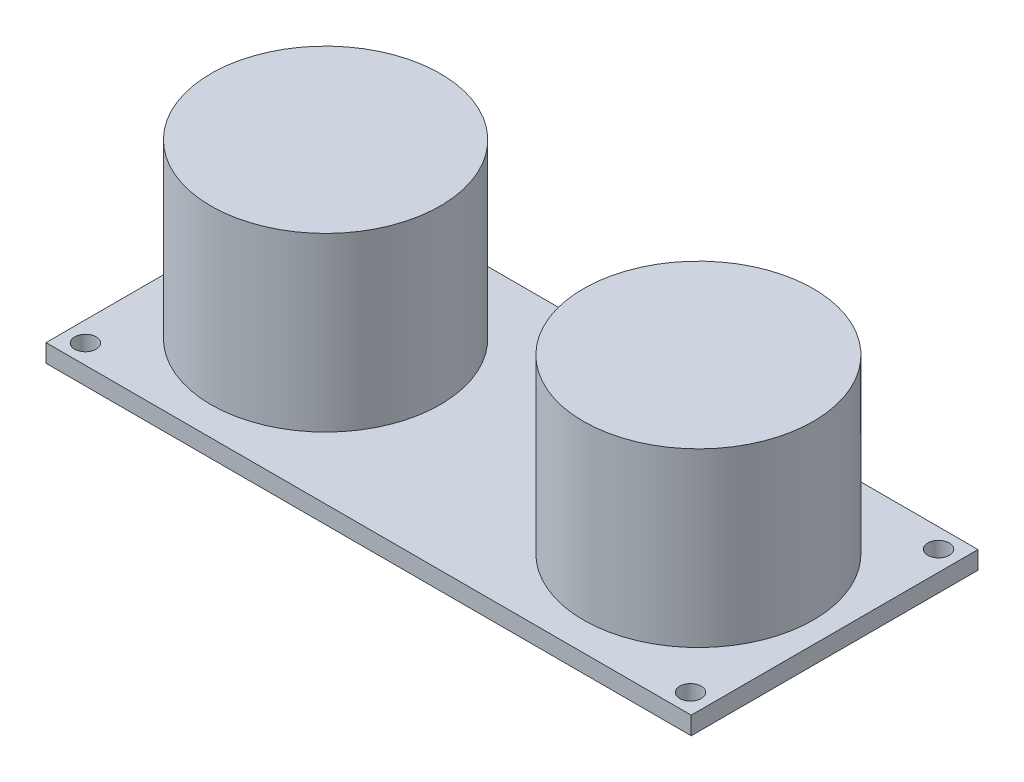
ISO-10303-21;
HEADER;
FILE_DESCRIPTION(('STEP AP214'),'2;1');
FILE_NAME('part.step','',(''),(''),'','','');
FILE_SCHEMA(('AUTOMOTIVE_DESIGN { 1 0 10303 214 1 1 1 1 }'));
ENDSEC;
DATA;
#1=APPLICATION_CONTEXT('core data for automotive mechanical design processes');
#2=APPLICATION_PROTOCOL_DEFINITION('international standard','automotive_design',2000,#1);
#3=PRODUCT_CONTEXT('',#1,'mechanical');
#4=PRODUCT('Part','Part','',(#3));
#5=PRODUCT_RELATED_PRODUCT_CATEGORY('part','',(#4));
#6=PRODUCT_DEFINITION_FORMATION('','',#4);
#7=PRODUCT_DEFINITION_CONTEXT('part definition',#1,'design');
#8=PRODUCT_DEFINITION('design','',#6,#7);
#9=PRODUCT_DEFINITION_SHAPE('','',#8);
#10=(LENGTH_UNIT() NAMED_UNIT(*) SI_UNIT(.MILLI.,.METRE.));
#11=(NAMED_UNIT(*) PLANE_ANGLE_UNIT() SI_UNIT($,.RADIAN.));
#12=(NAMED_UNIT(*) SI_UNIT($,.STERADIAN.) SOLID_ANGLE_UNIT());
#13=UNCERTAINTY_MEASURE_WITH_UNIT(LENGTH_MEASURE(1.E-05),#10,'distance_accuracy_value','');
#14=(GEOMETRIC_REPRESENTATION_CONTEXT(3) GLOBAL_UNCERTAINTY_ASSIGNED_CONTEXT((#13)) GLOBAL_UNIT_ASSIGNED_CONTEXT((#10,
#11,#12)) REPRESENTATION_CONTEXT('',''));
#15=CARTESIAN_POINT('',(0.,0.,0.));
#16=DIRECTION('',(0.,0.,1.));
#17=DIRECTION('',(1.,0.,0.));
#18=AXIS2_PLACEMENT_3D('',#15,#16,#17);
#19=CARTESIAN_POINT('',(0.,1.25,0.));
#20=DIRECTION('',(0.,1.,0.));
#21=DIRECTION('',(0.,0.,1.));
#22=AXIS2_PLACEMENT_3D('',#19,#20,#21);
#23=PLANE('',#22);
#24=CARTESIAN_POINT('',(35.5,1.25,10.));
#25=DIRECTION('',(0.,1.,0.));
#26=DIRECTION('',(0.,0.,1.));
#27=AXIS2_PLACEMENT_3D('',#24,#25,#26);
#28=CIRCLE('',#27,8.01810459145238);
#29=CARTESIAN_POINT('',(35.5,1.25,18.0181045914524));
#30=VERTEX_POINT('',#29);
#31=EDGE_CURVE('E180',#30,#30,#28,.T.);
#32=ORIENTED_EDGE('',*,*,#31,.F.);
#33=EDGE_LOOP('',(#32));
#34=FACE_BOUND('',#33,.T.);
#35=CARTESIAN_POINT('',(9.5,1.25,10.));
#36=DIRECTION('',(0.,1.,0.));
#37=DIRECTION('',(0.,0.,1.));
#38=AXIS2_PLACEMENT_3D('',#35,#36,#37);
#39=CIRCLE('',#38,8.);
#40=CARTESIAN_POINT('',(9.5,1.25,18.));
#41=VERTEX_POINT('',#40);
#42=EDGE_CURVE('E172',#41,#41,#39,.T.);
#43=ORIENTED_EDGE('',*,*,#42,.F.);
#44=EDGE_LOOP('',(#43));
#45=FACE_BOUND('',#44,.T.);
#46=CARTESIAN_POINT('',(43.6,1.25,18.65));
#47=DIRECTION('',(0.,1.,0.));
#48=DIRECTION('',(0.,0.,-1.));
#49=AXIS2_PLACEMENT_3D('',#46,#47,#48);
#50=CIRCLE('',#49,0.750000000000005);
#51=CARTESIAN_POINT('',(43.6,1.25,17.9));
#52=VERTEX_POINT('',#51);
#53=EDGE_CURVE('E152',#52,#52,#50,.T.);
#54=ORIENTED_EDGE('',*,*,#53,.F.);
#55=EDGE_LOOP('',(#54));
#56=FACE_BOUND('',#55,.T.);
#57=CARTESIAN_POINT('',(1.4,1.25,18.65));
#58=DIRECTION('',(0.,1.,0.));
#59=DIRECTION('',(0.,0.,1.));
#60=AXIS2_PLACEMENT_3D('',#57,#58,#59);
#61=CIRCLE('',#60,0.750000000000001);
#62=CARTESIAN_POINT('',(1.4,1.25,19.4));
#63=VERTEX_POINT('',#62);
#64=EDGE_CURVE('E122',#63,#63,#61,.T.);
#65=ORIENTED_EDGE('',*,*,#64,.F.);
#66=EDGE_LOOP('',(#65));
#67=FACE_BOUND('',#66,.T.);
#68=DIRECTION('',(0.,0.,1.));
#69=VECTOR('',#68,1.);
#70=CARTESIAN_POINT('',(0.,1.25,0.));
#71=LINE('',#70,#69);
#72=CARTESIAN_POINT('',(0.,1.25,0.));
#73=VERTEX_POINT('',#72);
#74=CARTESIAN_POINT('',(0.,1.25,20.));
#75=VERTEX_POINT('',#74);
#76=EDGE_CURVE('E102',#73,#75,#71,.T.);
#77=ORIENTED_EDGE('',*,*,#76,.T.);
#78=DIRECTION('',(1.,0.,0.));
#79=VECTOR('',#78,1.);
#80=CARTESIAN_POINT('',(0.,1.25,20.));
#81=LINE('',#80,#79);
#82=CARTESIAN_POINT('',(45.,1.25,20.));
#83=VERTEX_POINT('',#82);
#84=EDGE_CURVE('E96',#75,#83,#81,.T.);
#85=ORIENTED_EDGE('',*,*,#84,.T.);
#86=DIRECTION('',(0.,0.,-1.));
#87=VECTOR('',#86,1.);
#88=CARTESIAN_POINT('',(45.,1.25,0.));
#89=LINE('',#88,#87);
#90=CARTESIAN_POINT('',(45.,1.25,0.));
#91=VERTEX_POINT('',#90);
#92=EDGE_CURVE('E100',#83,#91,#89,.T.);
#93=ORIENTED_EDGE('',*,*,#92,.T.);
#94=DIRECTION('',(-1.,0.,0.));
#95=VECTOR('',#94,1.);
#96=CARTESIAN_POINT('',(0.,1.25,0.));
#97=LINE('',#96,#95);
#98=EDGE_CURVE('E61',#91,#73,#97,.T.);
#99=ORIENTED_EDGE('',*,*,#98,.T.);
#100=EDGE_LOOP('',(#77,#85,#93,#99));
#101=FACE_BOUND('',#100,.T.);
#102=CARTESIAN_POINT('',(1.4,1.25,1.35));
#103=DIRECTION('',(0.,1.,0.));
#104=DIRECTION('',(0.,0.,-1.));
#105=AXIS2_PLACEMENT_3D('',#102,#103,#104);
#106=CIRCLE('',#105,0.75);
#107=CARTESIAN_POINT('',(1.4,1.25,0.6));
#108=VERTEX_POINT('',#107);
#109=EDGE_CURVE('E144',#108,#108,#106,.T.);
#110=ORIENTED_EDGE('',*,*,#109,.F.);
#111=EDGE_LOOP('',(#110));
#112=FACE_BOUND('',#111,.T.);
#113=CARTESIAN_POINT('',(43.6,1.25,1.35));
#114=DIRECTION('',(0.,1.,0.));
#115=DIRECTION('',(0.,0.,1.));
#116=AXIS2_PLACEMENT_3D('',#113,#114,#115);
#117=CIRCLE('',#116,0.749999999999992);
#118=CARTESIAN_POINT('',(43.6,1.25,2.09999999999999));
#119=VERTEX_POINT('',#118);
#120=EDGE_CURVE('E160',#119,#119,#117,.T.);
#121=ORIENTED_EDGE('',*,*,#120,.F.);
#122=EDGE_LOOP('',(#121));
#123=FACE_BOUND('',#122,.T.);
#124=ADVANCED_FACE('F43',(#34,#45,#56,#67,#101,#112,#123),#23,.T.);
#125=CARTESIAN_POINT('',(0.,0.,0.));
#126=DIRECTION('',(0.,1.,0.));
#127=DIRECTION('',(0.,0.,1.));
#128=AXIS2_PLACEMENT_3D('',#125,#126,#127);
#129=PLANE('',#128);
#130=DIRECTION('',(0.,0.,1.));
#131=VECTOR('',#130,1.);
#132=CARTESIAN_POINT('',(0.,0.,0.));
#133=LINE('',#132,#131);
#134=CARTESIAN_POINT('',(0.,0.,0.));
#135=VERTEX_POINT('',#134);
#136=CARTESIAN_POINT('',(0.,0.,20.));
#137=VERTEX_POINT('',#136);
#138=EDGE_CURVE('E118',#135,#137,#133,.T.);
#139=ORIENTED_EDGE('',*,*,#138,.F.);
#140=DIRECTION('',(-1.,0.,0.));
#141=VECTOR('',#140,1.);
#142=CARTESIAN_POINT('',(0.,0.,0.));
#143=LINE('',#142,#141);
#144=CARTESIAN_POINT('',(45.,0.,0.));
#145=VERTEX_POINT('',#144);
#146=EDGE_CURVE('E89',#145,#135,#143,.T.);
#147=ORIENTED_EDGE('',*,*,#146,.F.);
#148=DIRECTION('',(0.,0.,-1.));
#149=VECTOR('',#148,1.);
#150=CARTESIAN_POINT('',(45.,0.,0.));
#151=LINE('',#150,#149);
#152=CARTESIAN_POINT('',(45.,0.,20.));
#153=VERTEX_POINT('',#152);
#154=EDGE_CURVE('E83',#153,#145,#151,.T.);
#155=ORIENTED_EDGE('',*,*,#154,.F.);
#156=DIRECTION('',(1.,0.,0.));
#157=VECTOR('',#156,1.);
#158=CARTESIAN_POINT('',(0.,0.,20.));
#159=LINE('',#158,#157);
#160=EDGE_CURVE('E107',#137,#153,#159,.T.);
#161=ORIENTED_EDGE('',*,*,#160,.F.);
#162=EDGE_LOOP('',(#139,#147,#155,#161));
#163=FACE_BOUND('',#162,.T.);
#164=CARTESIAN_POINT('',(1.4,0.,18.65));
#165=DIRECTION('',(0.,1.,0.));
#166=DIRECTION('',(0.,0.,1.));
#167=AXIS2_PLACEMENT_3D('',#164,#165,#166);
#168=CIRCLE('',#167,0.750000000000001);
#169=CARTESIAN_POINT('',(1.4,0.,19.4));
#170=VERTEX_POINT('',#169);
#171=EDGE_CURVE('E140',#170,#170,#168,.T.);
#172=ORIENTED_EDGE('',*,*,#171,.T.);
#173=EDGE_LOOP('',(#172));
#174=FACE_BOUND('',#173,.T.);
#175=CARTESIAN_POINT('',(1.4,0.,1.35));
#176=DIRECTION('',(0.,1.,0.));
#177=DIRECTION('',(0.,0.,-1.));
#178=AXIS2_PLACEMENT_3D('',#175,#176,#177);
#179=CIRCLE('',#178,0.75);
#180=CARTESIAN_POINT('',(1.4,0.,0.6));
#181=VERTEX_POINT('',#180);
#182=EDGE_CURVE('E148',#181,#181,#179,.T.);
#183=ORIENTED_EDGE('',*,*,#182,.T.);
#184=EDGE_LOOP('',(#183));
#185=FACE_BOUND('',#184,.T.);
#186=CARTESIAN_POINT('',(43.6,0.,18.65));
#187=DIRECTION('',(0.,1.,0.));
#188=DIRECTION('',(0.,0.,-1.));
#189=AXIS2_PLACEMENT_3D('',#186,#187,#188);
#190=CIRCLE('',#189,0.750000000000005);
#191=CARTESIAN_POINT('',(43.6,0.,17.9));
#192=VERTEX_POINT('',#191);
#193=EDGE_CURVE('E156',#192,#192,#190,.T.);
#194=ORIENTED_EDGE('',*,*,#193,.T.);
#195=EDGE_LOOP('',(#194));
#196=FACE_BOUND('',#195,.T.);
#197=CARTESIAN_POINT('',(43.6,0.,1.35));
#198=DIRECTION('',(0.,1.,0.));
#199=DIRECTION('',(0.,0.,1.));
#200=AXIS2_PLACEMENT_3D('',#197,#198,#199);
#201=CIRCLE('',#200,0.749999999999992);
#202=CARTESIAN_POINT('',(43.6,0.,2.09999999999999));
#203=VERTEX_POINT('',#202);
#204=EDGE_CURVE('E164',#203,#203,#201,.T.);
#205=ORIENTED_EDGE('',*,*,#204,.T.);
#206=EDGE_LOOP('',(#205));
#207=FACE_BOUND('',#206,.T.);
#208=ADVANCED_FACE('F135',(#163,#174,#185,#196,#207),#129,.F.);
#209=CARTESIAN_POINT('',(0.,1.25,0.));
#210=DIRECTION('',(1.,0.,0.));
#211=DIRECTION('',(0.,0.,-1.));
#212=AXIS2_PLACEMENT_3D('',#209,#210,#211);
#213=PLANE('',#212);
#214=ORIENTED_EDGE('',*,*,#138,.T.);
#215=DIRECTION('',(0.,-1.,0.));
#216=VECTOR('',#215,1.);
#217=CARTESIAN_POINT('',(0.,1.25,20.));
#218=LINE('',#217,#216);
#219=EDGE_CURVE('E11',#75,#137,#218,.T.);
#220=ORIENTED_EDGE('',*,*,#219,.F.);
#221=ORIENTED_EDGE('',*,*,#76,.F.);
#222=DIRECTION('',(0.,-1.,0.));
#223=VECTOR('',#222,1.);
#224=CARTESIAN_POINT('',(0.,1.25,0.));
#225=LINE('',#224,#223);
#226=EDGE_CURVE('E114',#73,#135,#225,.T.);
#227=ORIENTED_EDGE('',*,*,#226,.T.);
#228=EDGE_LOOP('',(#214,#220,#221,#227));
#229=FACE_BOUND('',#228,.T.);
#230=ADVANCED_FACE('F45',(#229),#213,.F.);
#231=CARTESIAN_POINT('',(0.,1.25,20.));
#232=DIRECTION('',(0.,0.,-1.));
#233=DIRECTION('',(-1.,0.,0.));
#234=AXIS2_PLACEMENT_3D('',#231,#232,#233);
#235=PLANE('',#234);
#236=ORIENTED_EDGE('',*,*,#160,.T.);
#237=DIRECTION('',(0.,-1.,0.));
#238=VECTOR('',#237,1.);
#239=CARTESIAN_POINT('',(45.,1.25,20.));
#240=LINE('',#239,#238);
#241=EDGE_CURVE('E53',#83,#153,#240,.T.);
#242=ORIENTED_EDGE('',*,*,#241,.F.);
#243=ORIENTED_EDGE('',*,*,#84,.F.);
#244=ORIENTED_EDGE('',*,*,#219,.T.);
#245=EDGE_LOOP('',(#236,#242,#243,#244));
#246=FACE_BOUND('',#245,.T.);
#247=ADVANCED_FACE('F106',(#246),#235,.F.);
#248=CARTESIAN_POINT('',(45.,1.25,0.));
#249=DIRECTION('',(-1.,0.,0.));
#250=DIRECTION('',(0.,0.,1.));
#251=AXIS2_PLACEMENT_3D('',#248,#249,#250);
#252=PLANE('',#251);
#253=ORIENTED_EDGE('',*,*,#154,.T.);
#254=DIRECTION('',(0.,-1.,0.));
#255=VECTOR('',#254,1.);
#256=CARTESIAN_POINT('',(45.,1.25,0.));
#257=LINE('',#256,#255);
#258=EDGE_CURVE('E109',#91,#145,#257,.T.);
#259=ORIENTED_EDGE('',*,*,#258,.F.);
#260=ORIENTED_EDGE('',*,*,#92,.F.);
#261=ORIENTED_EDGE('',*,*,#241,.T.);
#262=EDGE_LOOP('',(#253,#259,#260,#261));
#263=FACE_BOUND('',#262,.T.);
#264=ADVANCED_FACE('F110',(#263),#252,.F.);
#265=CARTESIAN_POINT('',(0.,1.25,0.));
#266=DIRECTION('',(0.,0.,1.));
#267=DIRECTION('',(1.,0.,0.));
#268=AXIS2_PLACEMENT_3D('',#265,#266,#267);
#269=PLANE('',#268);
#270=ORIENTED_EDGE('',*,*,#146,.T.);
#271=ORIENTED_EDGE('',*,*,#226,.F.);
#272=ORIENTED_EDGE('',*,*,#98,.F.);
#273=ORIENTED_EDGE('',*,*,#258,.T.);
#274=EDGE_LOOP('',(#270,#271,#272,#273));
#275=FACE_BOUND('',#274,.T.);
#276=ADVANCED_FACE('F132',(#275),#269,.F.);
#277=CARTESIAN_POINT('',(1.4,1.25,18.65));
#278=DIRECTION('',(0.,-1.,0.));
#279=DIRECTION('',(0.,0.,-1.));
#280=AXIS2_PLACEMENT_3D('',#277,#278,#279);
#281=CYLINDRICAL_SURFACE('',#280,0.750000000000001);
#282=ORIENTED_EDGE('',*,*,#64,.T.);
#283=EDGE_LOOP('',(#282));
#284=FACE_BOUND('',#283,.T.);
#285=ORIENTED_EDGE('',*,*,#171,.F.);
#286=EDGE_LOOP('',(#285));
#287=FACE_BOUND('',#286,.T.);
#288=ADVANCED_FACE('F206',(#284,#287),#281,.F.);
#289=CARTESIAN_POINT('',(1.4,1.25,1.35));
#290=DIRECTION('',(0.,-1.,0.));
#291=DIRECTION('',(0.,0.,-1.));
#292=AXIS2_PLACEMENT_3D('',#289,#290,#291);
#293=CYLINDRICAL_SURFACE('',#292,0.75);
#294=ORIENTED_EDGE('',*,*,#109,.T.);
#295=EDGE_LOOP('',(#294));
#296=FACE_BOUND('',#295,.T.);
#297=ORIENTED_EDGE('',*,*,#182,.F.);
#298=EDGE_LOOP('',(#297));
#299=FACE_BOUND('',#298,.T.);
#300=ADVANCED_FACE('F209',(#296,#299),#293,.F.);
#301=CARTESIAN_POINT('',(43.6,1.25,18.65));
#302=DIRECTION('',(0.,-1.,0.));
#303=DIRECTION('',(0.,0.,-1.));
#304=AXIS2_PLACEMENT_3D('',#301,#302,#303);
#305=CYLINDRICAL_SURFACE('',#304,0.750000000000005);
#306=ORIENTED_EDGE('',*,*,#53,.T.);
#307=EDGE_LOOP('',(#306));
#308=FACE_BOUND('',#307,.T.);
#309=ORIENTED_EDGE('',*,*,#193,.F.);
#310=EDGE_LOOP('',(#309));
#311=FACE_BOUND('',#310,.T.);
#312=ADVANCED_FACE('F224',(#308,#311),#305,.F.);
#313=CARTESIAN_POINT('',(43.6,1.25,1.35));
#314=DIRECTION('',(0.,-1.,0.));
#315=DIRECTION('',(0.,0.,-1.));
#316=AXIS2_PLACEMENT_3D('',#313,#314,#315);
#317=CYLINDRICAL_SURFACE('',#316,0.749999999999992);
#318=ORIENTED_EDGE('',*,*,#120,.T.);
#319=EDGE_LOOP('',(#318));
#320=FACE_BOUND('',#319,.T.);
#321=ORIENTED_EDGE('',*,*,#204,.F.);
#322=EDGE_LOOP('',(#321));
#323=FACE_BOUND('',#322,.T.);
#324=ADVANCED_FACE('F221',(#320,#323),#317,.F.);
#325=CARTESIAN_POINT('',(9.5,13.25,10.));
#326=DIRECTION('',(0.,-1.,0.));
#327=DIRECTION('',(0.,0.,-1.));
#328=AXIS2_PLACEMENT_3D('',#325,#326,#327);
#329=CYLINDRICAL_SURFACE('',#328,8.);
#330=CARTESIAN_POINT('',(9.5,13.25,10.));
#331=DIRECTION('',(0.,1.,0.));
#332=DIRECTION('',(0.,0.,1.));
#333=AXIS2_PLACEMENT_3D('',#330,#331,#332);
#334=CIRCLE('',#333,8.);
#335=CARTESIAN_POINT('',(9.5,13.25,18.));
#336=VERTEX_POINT('',#335);
#337=EDGE_CURVE('E168',#336,#336,#334,.T.);
#338=ORIENTED_EDGE('',*,*,#337,.F.);
#339=EDGE_LOOP('',(#338));
#340=FACE_BOUND('',#339,.T.);
#341=ORIENTED_EDGE('',*,*,#42,.T.);
#342=EDGE_LOOP('',(#341));
#343=FACE_BOUND('',#342,.T.);
#344=ADVANCED_FACE('F223',(#340,#343),#329,.T.);
#345=CARTESIAN_POINT('',(9.5,13.25,10.));
#346=DIRECTION('',(0.,1.,0.));
#347=DIRECTION('',(0.,0.,1.));
#348=AXIS2_PLACEMENT_3D('',#345,#346,#347);
#349=PLANE('',#348);
#350=ORIENTED_EDGE('',*,*,#337,.T.);
#351=EDGE_LOOP('',(#350));
#352=FACE_BOUND('',#351,.T.);
#353=ADVANCED_FACE('F193',(#352),#349,.T.);
#354=CARTESIAN_POINT('',(35.5,13.25,10.));
#355=DIRECTION('',(0.,-1.,0.));
#356=DIRECTION('',(0.,0.,-1.));
#357=AXIS2_PLACEMENT_3D('',#354,#355,#356);
#358=CYLINDRICAL_SURFACE('',#357,8.01810459145238);
#359=CARTESIAN_POINT('',(35.5,13.25,10.));
#360=DIRECTION('',(0.,1.,0.));
#361=DIRECTION('',(0.,0.,1.));
#362=AXIS2_PLACEMENT_3D('',#359,#360,#361);
#363=CIRCLE('',#362,8.01810459145238);
#364=CARTESIAN_POINT('',(35.5,13.25,18.0181045914524));
#365=VERTEX_POINT('',#364);
#366=EDGE_CURVE('E176',#365,#365,#363,.T.);
#367=ORIENTED_EDGE('',*,*,#366,.F.);
#368=EDGE_LOOP('',(#367));
#369=FACE_BOUND('',#368,.T.);
#370=ORIENTED_EDGE('',*,*,#31,.T.);
#371=EDGE_LOOP('',(#370));
#372=FACE_BOUND('',#371,.T.);
#373=ADVANCED_FACE('F190',(#369,#372),#358,.T.);
#374=CARTESIAN_POINT('',(35.5,13.25,10.));
#375=DIRECTION('',(0.,1.,0.));
#376=DIRECTION('',(0.,0.,1.));
#377=AXIS2_PLACEMENT_3D('',#374,#375,#376);
#378=PLANE('',#377);
#379=ORIENTED_EDGE('',*,*,#366,.T.);
#380=EDGE_LOOP('',(#379));
#381=FACE_BOUND('',#380,.T.);
#382=ADVANCED_FACE('F188',(#381),#378,.T.);
#383=CLOSED_SHELL('',(#124,#208,#230,#247,#264,#276,#288,#300,#312,#324,#344,#353,#373,#382));
#384=MANIFOLD_SOLID_BREP('B2',#383);
#385=ADVANCED_BREP_SHAPE_REPRESENTATION('',(#18,#384),#14);
#386=SHAPE_DEFINITION_REPRESENTATION(#9,#385);
ENDSEC;
END-ISO-10303-21;
